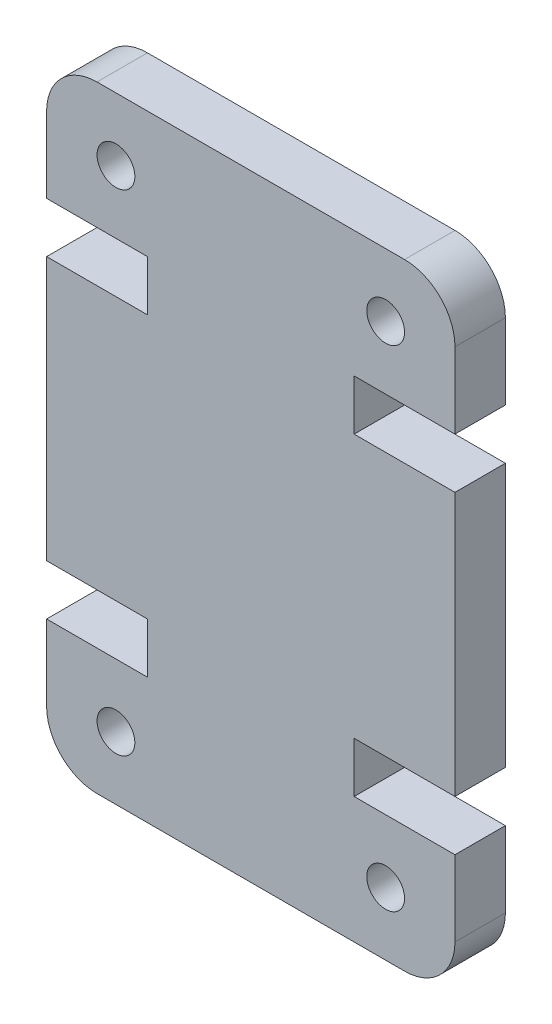
ISO-10303-21;
HEADER;
FILE_DESCRIPTION(('STEP AP214'),'2;1');
FILE_NAME('part.step','',(''),(''),'','','');
FILE_SCHEMA(('AUTOMOTIVE_DESIGN { 1 0 10303 214 1 1 1 1 }'));
ENDSEC;
DATA;
#1=APPLICATION_CONTEXT('core data for automotive mechanical design processes');
#2=APPLICATION_PROTOCOL_DEFINITION('international standard','automotive_design',2000,#1);
#3=PRODUCT_CONTEXT('',#1,'mechanical');
#4=PRODUCT('Part','Part','',(#3));
#5=PRODUCT_RELATED_PRODUCT_CATEGORY('part','',(#4));
#6=PRODUCT_DEFINITION_FORMATION('','',#4);
#7=PRODUCT_DEFINITION_CONTEXT('part definition',#1,'design');
#8=PRODUCT_DEFINITION('design','',#6,#7);
#9=PRODUCT_DEFINITION_SHAPE('','',#8);
#10=(LENGTH_UNIT() NAMED_UNIT(*) SI_UNIT(.MILLI.,.METRE.));
#11=(NAMED_UNIT(*) PLANE_ANGLE_UNIT() SI_UNIT($,.RADIAN.));
#12=(NAMED_UNIT(*) SI_UNIT($,.STERADIAN.) SOLID_ANGLE_UNIT());
#13=UNCERTAINTY_MEASURE_WITH_UNIT(LENGTH_MEASURE(1.E-05),#10,'distance_accuracy_value','');
#14=(GEOMETRIC_REPRESENTATION_CONTEXT(3) GLOBAL_UNCERTAINTY_ASSIGNED_CONTEXT((#13)) GLOBAL_UNIT_ASSIGNED_CONTEXT((#10,
#11,#12)) REPRESENTATION_CONTEXT('',''));
#15=CARTESIAN_POINT('',(0.,0.,0.));
#16=DIRECTION('',(0.,0.,1.));
#17=DIRECTION('',(1.,0.,0.));
#18=AXIS2_PLACEMENT_3D('',#15,#16,#17);
#19=CARTESIAN_POINT('',(2.,22.4500000000002,2.));
#20=DIRECTION('',(0.,0.,1.));
#21=DIRECTION('',(1.,0.,0.));
#22=AXIS2_PLACEMENT_3D('',#19,#20,#21);
#23=PLANE('',#22);
#24=CARTESIAN_POINT('',(13.4499999999968,21.9499999999998,2.));
#25=DIRECTION('',(0.,0.,1.));
#26=DIRECTION('',(1.,0.,0.));
#27=AXIS2_PLACEMENT_3D('',#24,#25,#26);
#28=CIRCLE('',#27,0.750000000000028);
#29=CARTESIAN_POINT('',(14.1999999999968,21.9499999999998,2.));
#30=VERTEX_POINT('',#29);
#31=EDGE_CURVE('E447',#30,#30,#28,.T.);
#32=ORIENTED_EDGE('',*,*,#31,.F.);
#33=EDGE_LOOP('',(#32));
#34=FACE_BOUND('',#33,.T.);
#35=CARTESIAN_POINT('',(13.4499999999983,2.49999999999968,2.));
#36=DIRECTION('',(0.,0.,1.));
#37=DIRECTION('',(1.,0.,0.));
#38=AXIS2_PLACEMENT_3D('',#35,#36,#37);
#39=CIRCLE('',#38,0.750000000000028);
#40=CARTESIAN_POINT('',(14.1999999999984,2.49999999999968,2.));
#41=VERTEX_POINT('',#40);
#42=EDGE_CURVE('E229',#41,#41,#39,.T.);
#43=ORIENTED_EDGE('',*,*,#42,.F.);
#44=EDGE_LOOP('',(#43));
#45=FACE_BOUND('',#44,.T.);
#46=CARTESIAN_POINT('',(2.,22.4500000000002,2.));
#47=DIRECTION('',(0.,0.,1.));
#48=DIRECTION('',(1.,0.,0.));
#49=AXIS2_PLACEMENT_3D('',#46,#47,#48);
#50=CIRCLE('',#49,2.);
#51=CARTESIAN_POINT('',(2.,24.4500000000002,2.));
#52=VERTEX_POINT('',#51);
#53=CARTESIAN_POINT('',(0.,22.4499999999998,2.));
#54=VERTEX_POINT('',#53);
#55=EDGE_CURVE('E272',#52,#54,#50,.T.);
#56=ORIENTED_EDGE('',*,*,#55,.T.);
#57=DIRECTION('',(0.,-1.,0.));
#58=VECTOR('',#57,1.);
#59=CARTESIAN_POINT('',(0.,22.4499999999998,2.));
#60=LINE('',#59,#58);
#61=CARTESIAN_POINT('',(0.,19.4500000000001,2.));
#62=VERTEX_POINT('',#61);
#63=EDGE_CURVE('E140',#54,#62,#60,.T.);
#64=ORIENTED_EDGE('',*,*,#63,.T.);
#65=DIRECTION('',(1.,0.,0.));
#66=VECTOR('',#65,1.);
#67=CARTESIAN_POINT('',(0.,19.4500000000001,2.));
#68=LINE('',#67,#66);
#69=CARTESIAN_POINT('',(4.00000000000111,19.4500000000001,2.));
#70=VERTEX_POINT('',#69);
#71=EDGE_CURVE('E335',#62,#70,#68,.T.);
#72=ORIENTED_EDGE('',*,*,#71,.T.);
#73=DIRECTION('',(0.,-1.,0.));
#74=VECTOR('',#73,1.);
#75=CARTESIAN_POINT('',(4.00000000000111,19.4500000000001,2.));
#76=LINE('',#75,#74);
#77=CARTESIAN_POINT('',(4.00000000000111,17.4500000000001,2.));
#78=VERTEX_POINT('',#77);
#79=EDGE_CURVE('E354',#70,#78,#76,.T.);
#80=ORIENTED_EDGE('',*,*,#79,.T.);
#81=DIRECTION('',(-1.,0.,0.));
#82=VECTOR('',#81,1.);
#83=CARTESIAN_POINT('',(4.00000000000111,17.4500000000001,2.));
#84=LINE('',#83,#82);
#85=CARTESIAN_POINT('',(0.,17.4500000000001,2.));
#86=VERTEX_POINT('',#85);
#87=EDGE_CURVE('E351',#78,#86,#84,.T.);
#88=ORIENTED_EDGE('',*,*,#87,.T.);
#89=DIRECTION('',(0.,-1.,0.));
#90=VECTOR('',#89,1.);
#91=CARTESIAN_POINT('',(0.,17.4500000000001,2.));
#92=LINE('',#91,#90);
#93=CARTESIAN_POINT('',(0.,7.00000000000012,2.));
#94=VERTEX_POINT('',#93);
#95=EDGE_CURVE('E353',#86,#94,#92,.T.);
#96=ORIENTED_EDGE('',*,*,#95,.T.);
#97=DIRECTION('',(1.,0.,0.));
#98=VECTOR('',#97,1.);
#99=CARTESIAN_POINT('',(0.,7.00000000000012,2.));
#100=LINE('',#99,#98);
#101=CARTESIAN_POINT('',(4.00000000000045,7.00000000000012,2.));
#102=VERTEX_POINT('',#101);
#103=EDGE_CURVE('E356',#94,#102,#100,.T.);
#104=ORIENTED_EDGE('',*,*,#103,.T.);
#105=DIRECTION('',(0.,-1.,0.));
#106=VECTOR('',#105,1.);
#107=CARTESIAN_POINT('',(4.00000000000045,7.00000000000012,2.));
#108=LINE('',#107,#106);
#109=CARTESIAN_POINT('',(4.00000000000045,5.00000000000014,2.));
#110=VERTEX_POINT('',#109);
#111=EDGE_CURVE('E362',#102,#110,#108,.T.);
#112=ORIENTED_EDGE('',*,*,#111,.T.);
#113=DIRECTION('',(-1.,0.,0.));
#114=VECTOR('',#113,1.);
#115=CARTESIAN_POINT('',(4.00000000000045,5.00000000000014,2.));
#116=LINE('',#115,#114);
#117=CARTESIAN_POINT('',(0.,5.00000000000014,2.));
#118=VERTEX_POINT('',#117);
#119=EDGE_CURVE('E364',#110,#118,#116,.T.);
#120=ORIENTED_EDGE('',*,*,#119,.T.);
#121=DIRECTION('',(0.,-1.,0.));
#122=VECTOR('',#121,1.);
#123=CARTESIAN_POINT('',(0.,5.00000000000014,2.));
#124=LINE('',#123,#122);
#125=CARTESIAN_POINT('',(0.,2.00000000000002,2.));
#126=VERTEX_POINT('',#125);
#127=EDGE_CURVE('E366',#118,#126,#124,.T.);
#128=ORIENTED_EDGE('',*,*,#127,.T.);
#129=CARTESIAN_POINT('',(2.,2.,2.));
#130=DIRECTION('',(0.,0.,1.));
#131=DIRECTION('',(1.,0.,0.));
#132=AXIS2_PLACEMENT_3D('',#129,#130,#131);
#133=CIRCLE('',#132,2.);
#134=CARTESIAN_POINT('',(2.,0.,2.));
#135=VERTEX_POINT('',#134);
#136=EDGE_CURVE('E368',#126,#135,#133,.T.);
#137=ORIENTED_EDGE('',*,*,#136,.T.);
#138=DIRECTION('',(1.,0.,0.));
#139=VECTOR('',#138,1.);
#140=CARTESIAN_POINT('',(2.,0.,2.));
#141=LINE('',#140,#139);
#142=CARTESIAN_POINT('',(14.1999999999865,0.,2.));
#143=VERTEX_POINT('',#142);
#144=EDGE_CURVE('E370',#135,#143,#141,.T.);
#145=ORIENTED_EDGE('',*,*,#144,.T.);
#146=CARTESIAN_POINT('',(14.1999999999856,1.99999999999989,2.));
#147=DIRECTION('',(0.,0.,1.));
#148=DIRECTION('',(1.,0.,0.));
#149=AXIS2_PLACEMENT_3D('',#146,#147,#148);
#150=CIRCLE('',#149,1.99999999999989);
#151=CARTESIAN_POINT('',(16.1999999999855,1.99999999999992,2.));
#152=VERTEX_POINT('',#151);
#153=EDGE_CURVE('E372',#143,#152,#150,.T.);
#154=ORIENTED_EDGE('',*,*,#153,.T.);
#155=DIRECTION('',(0.,1.,0.));
#156=VECTOR('',#155,1.);
#157=CARTESIAN_POINT('',(16.1999999999855,5.00000000000003,2.));
#158=LINE('',#157,#156);
#159=CARTESIAN_POINT('',(16.1999999999855,5.00000000000003,2.));
#160=VERTEX_POINT('',#159);
#161=EDGE_CURVE('E374',#152,#160,#158,.T.);
#162=ORIENTED_EDGE('',*,*,#161,.T.);
#163=DIRECTION('',(-1.,0.,0.));
#164=VECTOR('',#163,1.);
#165=CARTESIAN_POINT('',(12.1999999999864,5.00000000000003,2.));
#166=LINE('',#165,#164);
#167=CARTESIAN_POINT('',(12.1999999999864,5.00000000000003,2.));
#168=VERTEX_POINT('',#167);
#169=EDGE_CURVE('E376',#160,#168,#166,.T.);
#170=ORIENTED_EDGE('',*,*,#169,.T.);
#171=DIRECTION('',(0.,1.,0.));
#172=VECTOR('',#171,1.);
#173=CARTESIAN_POINT('',(12.1999999999864,7.00000000000002,2.));
#174=LINE('',#173,#172);
#175=CARTESIAN_POINT('',(12.1999999999864,7.00000000000002,2.));
#176=VERTEX_POINT('',#175);
#177=EDGE_CURVE('E378',#168,#176,#174,.T.);
#178=ORIENTED_EDGE('',*,*,#177,.T.);
#179=DIRECTION('',(1.,0.,0.));
#180=VECTOR('',#179,1.);
#181=CARTESIAN_POINT('',(16.1999999999991,7.00000000000002,2.));
#182=LINE('',#181,#180);
#183=CARTESIAN_POINT('',(16.1999999999991,7.00000000000002,2.));
#184=VERTEX_POINT('',#183);
#185=EDGE_CURVE('E380',#176,#184,#182,.T.);
#186=ORIENTED_EDGE('',*,*,#185,.T.);
#187=DIRECTION('',(0.,1.,0.));
#188=VECTOR('',#187,1.);
#189=CARTESIAN_POINT('',(16.1999999999991,17.4499999999885,2.));
#190=LINE('',#189,#188);
#191=CARTESIAN_POINT('',(16.1999999999991,17.4499999999885,2.));
#192=VERTEX_POINT('',#191);
#193=EDGE_CURVE('E382',#184,#192,#190,.T.);
#194=ORIENTED_EDGE('',*,*,#193,.T.);
#195=DIRECTION('',(-1.,0.,0.));
#196=VECTOR('',#195,1.);
#197=CARTESIAN_POINT('',(12.2000000000207,17.4499999999885,2.));
#198=LINE('',#197,#196);
#199=CARTESIAN_POINT('',(12.2000000000207,17.4499999999885,2.));
#200=VERTEX_POINT('',#199);
#201=EDGE_CURVE('E384',#192,#200,#198,.T.);
#202=ORIENTED_EDGE('',*,*,#201,.T.);
#203=DIRECTION('',(0.,1.,0.));
#204=VECTOR('',#203,1.);
#205=CARTESIAN_POINT('',(12.2000000000207,19.4499999999884,2.));
#206=LINE('',#205,#204);
#207=CARTESIAN_POINT('',(12.2000000000207,19.4499999999884,2.));
#208=VERTEX_POINT('',#207);
#209=EDGE_CURVE('E386',#200,#208,#206,.T.);
#210=ORIENTED_EDGE('',*,*,#209,.T.);
#211=DIRECTION('',(1.,0.,0.));
#212=VECTOR('',#211,1.);
#213=CARTESIAN_POINT('',(16.1999999999991,19.4499999999884,2.));
#214=LINE('',#213,#212);
#215=CARTESIAN_POINT('',(16.1999999999991,19.4499999999884,2.));
#216=VERTEX_POINT('',#215);
#217=EDGE_CURVE('E207',#208,#216,#214,.T.);
#218=ORIENTED_EDGE('',*,*,#217,.T.);
#219=DIRECTION('',(0.,1.,0.));
#220=VECTOR('',#219,1.);
#221=CARTESIAN_POINT('',(16.1999999999991,22.4499999999999,2.));
#222=LINE('',#221,#220);
#223=CARTESIAN_POINT('',(16.1999999999991,22.4499999999999,2.));
#224=VERTEX_POINT('',#223);
#225=EDGE_CURVE('E201',#216,#224,#222,.T.);
#226=ORIENTED_EDGE('',*,*,#225,.T.);
#227=CARTESIAN_POINT('',(14.1999999999992,22.4500000000003,2.));
#228=DIRECTION('',(0.,0.,1.));
#229=DIRECTION('',(1.,0.,0.));
#230=AXIS2_PLACEMENT_3D('',#227,#228,#229);
#231=CIRCLE('',#230,1.99999999999991);
#232=CARTESIAN_POINT('',(14.1999999999992,24.4500000000002,2.));
#233=VERTEX_POINT('',#232);
#234=EDGE_CURVE('E205',#224,#233,#231,.T.);
#235=ORIENTED_EDGE('',*,*,#234,.T.);
#236=DIRECTION('',(-1.,0.,0.));
#237=VECTOR('',#236,1.);
#238=CARTESIAN_POINT('',(2.,24.4500000000002,2.));
#239=LINE('',#238,#237);
#240=EDGE_CURVE('E49',#233,#52,#239,.T.);
#241=ORIENTED_EDGE('',*,*,#240,.T.);
#242=EDGE_LOOP('',(#56,#64,#72,#80,#88,#96,#104,#112,#120,#128,#137,#145,#154,#162,#170,#178,
#186,#194,#202,#210,#218,#226,#235,#241));
#243=FACE_BOUND('',#242,.T.);
#244=CARTESIAN_POINT('',(2.74999999999805,2.4999999999999,2.));
#245=DIRECTION('',(0.,0.,1.));
#246=DIRECTION('',(1.,0.,0.));
#247=AXIS2_PLACEMENT_3D('',#244,#245,#246);
#248=CIRCLE('',#247,0.750000000000028);
#249=CARTESIAN_POINT('',(3.49999999999808,2.4999999999999,2.));
#250=VERTEX_POINT('',#249);
#251=EDGE_CURVE('E453',#250,#250,#248,.T.);
#252=ORIENTED_EDGE('',*,*,#251,.F.);
#253=EDGE_LOOP('',(#252));
#254=FACE_BOUND('',#253,.T.);
#255=CARTESIAN_POINT('',(2.74999999999672,21.95,2.));
#256=DIRECTION('',(0.,0.,1.));
#257=DIRECTION('',(1.,0.,0.));
#258=AXIS2_PLACEMENT_3D('',#255,#256,#257);
#259=CIRCLE('',#258,0.750000000000028);
#260=CARTESIAN_POINT('',(3.49999999999675,21.95,2.));
#261=VERTEX_POINT('',#260);
#262=EDGE_CURVE('E438',#261,#261,#259,.T.);
#263=ORIENTED_EDGE('',*,*,#262,.F.);
#264=EDGE_LOOP('',(#263));
#265=FACE_BOUND('',#264,.T.);
#266=ADVANCED_FACE('F32',(#34,#45,#243,#254,#265),#23,.T.);
#267=CARTESIAN_POINT('',(2.,22.4500000000002,0.));
#268=DIRECTION('',(0.,0.,1.));
#269=DIRECTION('',(1.,0.,0.));
#270=AXIS2_PLACEMENT_3D('',#267,#268,#269);
#271=PLANE('',#270);
#272=CARTESIAN_POINT('',(13.4499999999968,21.9499999999998,0.));
#273=DIRECTION('',(0.,0.,1.));
#274=DIRECTION('',(1.,0.,0.));
#275=AXIS2_PLACEMENT_3D('',#272,#273,#274);
#276=CIRCLE('',#275,0.750000000000028);
#277=CARTESIAN_POINT('',(14.1999999999968,21.9499999999998,0.));
#278=VERTEX_POINT('',#277);
#279=EDGE_CURVE('E444',#278,#278,#276,.T.);
#280=ORIENTED_EDGE('',*,*,#279,.T.);
#281=EDGE_LOOP('',(#280));
#282=FACE_BOUND('',#281,.T.);
#283=CARTESIAN_POINT('',(13.4499999999983,2.49999999999968,0.));
#284=DIRECTION('',(0.,0.,1.));
#285=DIRECTION('',(1.,0.,0.));
#286=AXIS2_PLACEMENT_3D('',#283,#284,#285);
#287=CIRCLE('',#286,0.750000000000028);
#288=CARTESIAN_POINT('',(14.1999999999984,2.49999999999968,0.));
#289=VERTEX_POINT('',#288);
#290=EDGE_CURVE('E456',#289,#289,#287,.T.);
#291=ORIENTED_EDGE('',*,*,#290,.T.);
#292=EDGE_LOOP('',(#291));
#293=FACE_BOUND('',#292,.T.);
#294=CARTESIAN_POINT('',(2.,22.4500000000002,0.));
#295=DIRECTION('',(0.,0.,1.));
#296=DIRECTION('',(1.,0.,0.));
#297=AXIS2_PLACEMENT_3D('',#294,#295,#296);
#298=CIRCLE('',#297,2.);
#299=CARTESIAN_POINT('',(2.,24.4500000000002,0.));
#300=VERTEX_POINT('',#299);
#301=CARTESIAN_POINT('',(0.,22.4499999999998,0.));
#302=VERTEX_POINT('',#301);
#303=EDGE_CURVE('E225',#300,#302,#298,.T.);
#304=ORIENTED_EDGE('',*,*,#303,.F.);
#305=DIRECTION('',(-1.,0.,0.));
#306=VECTOR('',#305,1.);
#307=CARTESIAN_POINT('',(2.,24.4500000000002,0.));
#308=LINE('',#307,#306);
#309=CARTESIAN_POINT('',(14.1999999999992,24.4500000000002,0.));
#310=VERTEX_POINT('',#309);
#311=EDGE_CURVE('E132',#310,#300,#308,.T.);
#312=ORIENTED_EDGE('',*,*,#311,.F.);
#313=CARTESIAN_POINT('',(14.1999999999992,22.4500000000003,0.));
#314=DIRECTION('',(0.,0.,1.));
#315=DIRECTION('',(1.,0.,0.));
#316=AXIS2_PLACEMENT_3D('',#313,#314,#315);
#317=CIRCLE('',#316,1.99999999999991);
#318=CARTESIAN_POINT('',(16.1999999999991,22.4499999999999,0.));
#319=VERTEX_POINT('',#318);
#320=EDGE_CURVE('E126',#319,#310,#317,.T.);
#321=ORIENTED_EDGE('',*,*,#320,.F.);
#322=DIRECTION('',(0.,1.,0.));
#323=VECTOR('',#322,1.);
#324=CARTESIAN_POINT('',(16.1999999999991,22.4499999999999,0.));
#325=LINE('',#324,#323);
#326=CARTESIAN_POINT('',(16.1999999999991,19.4499999999884,0.));
#327=VERTEX_POINT('',#326);
#328=EDGE_CURVE('E215',#327,#319,#325,.T.);
#329=ORIENTED_EDGE('',*,*,#328,.F.);
#330=DIRECTION('',(1.,0.,0.));
#331=VECTOR('',#330,1.);
#332=CARTESIAN_POINT('',(16.1999999999991,19.4499999999884,0.));
#333=LINE('',#332,#331);
#334=CARTESIAN_POINT('',(12.2000000000207,19.4499999999884,0.));
#335=VERTEX_POINT('',#334);
#336=EDGE_CURVE('E267',#335,#327,#333,.T.);
#337=ORIENTED_EDGE('',*,*,#336,.F.);
#338=DIRECTION('',(0.,1.,0.));
#339=VECTOR('',#338,1.);
#340=CARTESIAN_POINT('',(12.2000000000207,19.4499999999884,0.));
#341=LINE('',#340,#339);
#342=CARTESIAN_POINT('',(12.2000000000207,17.4499999999885,0.));
#343=VERTEX_POINT('',#342);
#344=EDGE_CURVE('E265',#343,#335,#341,.T.);
#345=ORIENTED_EDGE('',*,*,#344,.F.);
#346=DIRECTION('',(-1.,0.,0.));
#347=VECTOR('',#346,1.);
#348=CARTESIAN_POINT('',(12.2000000000207,17.4499999999885,0.));
#349=LINE('',#348,#347);
#350=CARTESIAN_POINT('',(16.1999999999991,17.4499999999885,0.));
#351=VERTEX_POINT('',#350);
#352=EDGE_CURVE('E263',#351,#343,#349,.T.);
#353=ORIENTED_EDGE('',*,*,#352,.F.);
#354=DIRECTION('',(0.,1.,0.));
#355=VECTOR('',#354,1.);
#356=CARTESIAN_POINT('',(16.1999999999991,17.4499999999885,0.));
#357=LINE('',#356,#355);
#358=CARTESIAN_POINT('',(16.1999999999991,7.00000000000002,0.));
#359=VERTEX_POINT('',#358);
#360=EDGE_CURVE('E261',#359,#351,#357,.T.);
#361=ORIENTED_EDGE('',*,*,#360,.F.);
#362=DIRECTION('',(1.,0.,0.));
#363=VECTOR('',#362,1.);
#364=CARTESIAN_POINT('',(16.1999999999991,7.00000000000002,0.));
#365=LINE('',#364,#363);
#366=CARTESIAN_POINT('',(12.1999999999864,7.00000000000002,0.));
#367=VERTEX_POINT('',#366);
#368=EDGE_CURVE('E259',#367,#359,#365,.T.);
#369=ORIENTED_EDGE('',*,*,#368,.F.);
#370=DIRECTION('',(0.,1.,0.));
#371=VECTOR('',#370,1.);
#372=CARTESIAN_POINT('',(12.1999999999864,7.00000000000002,0.));
#373=LINE('',#372,#371);
#374=CARTESIAN_POINT('',(12.1999999999864,5.00000000000003,0.));
#375=VERTEX_POINT('',#374);
#376=EDGE_CURVE('E257',#375,#367,#373,.T.);
#377=ORIENTED_EDGE('',*,*,#376,.F.);
#378=DIRECTION('',(-1.,0.,0.));
#379=VECTOR('',#378,1.);
#380=CARTESIAN_POINT('',(12.1999999999864,5.00000000000003,0.));
#381=LINE('',#380,#379);
#382=CARTESIAN_POINT('',(16.1999999999855,5.00000000000003,0.));
#383=VERTEX_POINT('',#382);
#384=EDGE_CURVE('E255',#383,#375,#381,.T.);
#385=ORIENTED_EDGE('',*,*,#384,.F.);
#386=DIRECTION('',(0.,1.,0.));
#387=VECTOR('',#386,1.);
#388=CARTESIAN_POINT('',(16.1999999999855,5.00000000000003,0.));
#389=LINE('',#388,#387);
#390=CARTESIAN_POINT('',(16.1999999999855,1.99999999999992,0.));
#391=VERTEX_POINT('',#390);
#392=EDGE_CURVE('E253',#391,#383,#389,.T.);
#393=ORIENTED_EDGE('',*,*,#392,.F.);
#394=CARTESIAN_POINT('',(14.1999999999856,1.99999999999989,0.));
#395=DIRECTION('',(0.,0.,1.));
#396=DIRECTION('',(1.,0.,0.));
#397=AXIS2_PLACEMENT_3D('',#394,#395,#396);
#398=CIRCLE('',#397,1.99999999999989);
#399=CARTESIAN_POINT('',(14.1999999999865,0.,0.));
#400=VERTEX_POINT('',#399);
#401=EDGE_CURVE('E251',#400,#391,#398,.T.);
#402=ORIENTED_EDGE('',*,*,#401,.F.);
#403=DIRECTION('',(1.,0.,0.));
#404=VECTOR('',#403,1.);
#405=CARTESIAN_POINT('',(2.,0.,0.));
#406=LINE('',#405,#404);
#407=CARTESIAN_POINT('',(2.,0.,0.));
#408=VERTEX_POINT('',#407);
#409=EDGE_CURVE('E249',#408,#400,#406,.T.);
#410=ORIENTED_EDGE('',*,*,#409,.F.);
#411=CARTESIAN_POINT('',(2.,2.,0.));
#412=DIRECTION('',(0.,0.,1.));
#413=DIRECTION('',(1.,0.,0.));
#414=AXIS2_PLACEMENT_3D('',#411,#412,#413);
#415=CIRCLE('',#414,2.);
#416=CARTESIAN_POINT('',(0.,2.00000000000002,0.));
#417=VERTEX_POINT('',#416);
#418=EDGE_CURVE('E247',#417,#408,#415,.T.);
#419=ORIENTED_EDGE('',*,*,#418,.F.);
#420=DIRECTION('',(0.,-1.,0.));
#421=VECTOR('',#420,1.);
#422=CARTESIAN_POINT('',(0.,5.00000000000014,0.));
#423=LINE('',#422,#421);
#424=CARTESIAN_POINT('',(0.,5.00000000000014,0.));
#425=VERTEX_POINT('',#424);
#426=EDGE_CURVE('E245',#425,#417,#423,.T.);
#427=ORIENTED_EDGE('',*,*,#426,.F.);
#428=DIRECTION('',(-1.,0.,0.));
#429=VECTOR('',#428,1.);
#430=CARTESIAN_POINT('',(4.00000000000045,5.00000000000014,0.));
#431=LINE('',#430,#429);
#432=CARTESIAN_POINT('',(4.00000000000045,5.00000000000014,0.));
#433=VERTEX_POINT('',#432);
#434=EDGE_CURVE('E243',#433,#425,#431,.T.);
#435=ORIENTED_EDGE('',*,*,#434,.F.);
#436=DIRECTION('',(0.,-1.,0.));
#437=VECTOR('',#436,1.);
#438=CARTESIAN_POINT('',(4.00000000000045,7.00000000000012,0.));
#439=LINE('',#438,#437);
#440=CARTESIAN_POINT('',(4.00000000000045,7.00000000000012,0.));
#441=VERTEX_POINT('',#440);
#442=EDGE_CURVE('E241',#441,#433,#439,.T.);
#443=ORIENTED_EDGE('',*,*,#442,.F.);
#444=DIRECTION('',(1.,0.,0.));
#445=VECTOR('',#444,1.);
#446=CARTESIAN_POINT('',(0.,7.00000000000012,0.));
#447=LINE('',#446,#445);
#448=CARTESIAN_POINT('',(0.,7.00000000000012,0.));
#449=VERTEX_POINT('',#448);
#450=EDGE_CURVE('E239',#449,#441,#447,.T.);
#451=ORIENTED_EDGE('',*,*,#450,.F.);
#452=DIRECTION('',(0.,-1.,0.));
#453=VECTOR('',#452,1.);
#454=CARTESIAN_POINT('',(0.,17.4500000000001,0.));
#455=LINE('',#454,#453);
#456=CARTESIAN_POINT('',(0.,17.4500000000001,0.));
#457=VERTEX_POINT('',#456);
#458=EDGE_CURVE('E237',#457,#449,#455,.T.);
#459=ORIENTED_EDGE('',*,*,#458,.F.);
#460=DIRECTION('',(-1.,0.,0.));
#461=VECTOR('',#460,1.);
#462=CARTESIAN_POINT('',(4.00000000000111,17.4500000000001,0.));
#463=LINE('',#462,#461);
#464=CARTESIAN_POINT('',(4.00000000000111,17.4500000000001,0.));
#465=VERTEX_POINT('',#464);
#466=EDGE_CURVE('E235',#465,#457,#463,.T.);
#467=ORIENTED_EDGE('',*,*,#466,.F.);
#468=DIRECTION('',(0.,-1.,0.));
#469=VECTOR('',#468,1.);
#470=CARTESIAN_POINT('',(4.00000000000111,19.4500000000001,0.));
#471=LINE('',#470,#469);
#472=CARTESIAN_POINT('',(4.00000000000111,19.4500000000001,0.));
#473=VERTEX_POINT('',#472);
#474=EDGE_CURVE('E233',#473,#465,#471,.T.);
#475=ORIENTED_EDGE('',*,*,#474,.F.);
#476=DIRECTION('',(1.,0.,0.));
#477=VECTOR('',#476,1.);
#478=CARTESIAN_POINT('',(0.,19.4500000000001,0.));
#479=LINE('',#478,#477);
#480=CARTESIAN_POINT('',(0.,19.4500000000001,0.));
#481=VERTEX_POINT('',#480);
#482=EDGE_CURVE('E231',#481,#473,#479,.T.);
#483=ORIENTED_EDGE('',*,*,#482,.F.);
#484=DIRECTION('',(0.,-1.,0.));
#485=VECTOR('',#484,1.);
#486=CARTESIAN_POINT('',(0.,22.4499999999998,0.));
#487=LINE('',#486,#485);
#488=EDGE_CURVE('E228',#302,#481,#487,.T.);
#489=ORIENTED_EDGE('',*,*,#488,.F.);
#490=EDGE_LOOP('',(#304,#312,#321,#329,#337,#345,#353,#361,#369,#377,#385,#393,#402,#410,#419,
#427,#435,#443,#451,#459,#467,#475,#483,#489));
#491=FACE_BOUND('',#490,.T.);
#492=CARTESIAN_POINT('',(2.74999999999805,2.4999999999999,0.));
#493=DIRECTION('',(0.,0.,1.));
#494=DIRECTION('',(1.,0.,0.));
#495=AXIS2_PLACEMENT_3D('',#492,#493,#494);
#496=CIRCLE('',#495,0.750000000000028);
#497=CARTESIAN_POINT('',(3.49999999999808,2.4999999999999,0.));
#498=VERTEX_POINT('',#497);
#499=EDGE_CURVE('E450',#498,#498,#496,.T.);
#500=ORIENTED_EDGE('',*,*,#499,.T.);
#501=EDGE_LOOP('',(#500));
#502=FACE_BOUND('',#501,.T.);
#503=CARTESIAN_POINT('',(2.74999999999672,21.95,0.));
#504=DIRECTION('',(0.,0.,1.));
#505=DIRECTION('',(1.,0.,0.));
#506=AXIS2_PLACEMENT_3D('',#503,#504,#505);
#507=CIRCLE('',#506,0.750000000000028);
#508=CARTESIAN_POINT('',(3.49999999999675,21.95,0.));
#509=VERTEX_POINT('',#508);
#510=EDGE_CURVE('E441',#509,#509,#507,.T.);
#511=ORIENTED_EDGE('',*,*,#510,.T.);
#512=EDGE_LOOP('',(#511));
#513=FACE_BOUND('',#512,.T.);
#514=ADVANCED_FACE('F339',(#282,#293,#491,#502,#513),#271,.F.);
#515=CARTESIAN_POINT('',(2.,22.4500000000002,2.));
#516=DIRECTION('',(0.,0.,-1.));
#517=DIRECTION('',(-1.,0.,0.));
#518=AXIS2_PLACEMENT_3D('',#515,#516,#517);
#519=CYLINDRICAL_SURFACE('',#518,2.);
#520=ORIENTED_EDGE('',*,*,#303,.T.);
#521=DIRECTION('',(0.,0.,-1.));
#522=VECTOR('',#521,1.);
#523=CARTESIAN_POINT('',(0.,22.4499999999998,2.));
#524=LINE('',#523,#522);
#525=EDGE_CURVE('E11',#54,#302,#524,.T.);
#526=ORIENTED_EDGE('',*,*,#525,.F.);
#527=ORIENTED_EDGE('',*,*,#55,.F.);
#528=DIRECTION('',(0.,0.,-1.));
#529=VECTOR('',#528,1.);
#530=CARTESIAN_POINT('',(2.,24.4500000000002,2.));
#531=LINE('',#530,#529);
#532=EDGE_CURVE('E221',#52,#300,#531,.T.);
#533=ORIENTED_EDGE('',*,*,#532,.T.);
#534=EDGE_LOOP('',(#520,#526,#527,#533));
#535=FACE_BOUND('',#534,.T.);
#536=ADVANCED_FACE('F34',(#535),#519,.T.);
#537=CARTESIAN_POINT('',(0.,22.4499999999998,2.));
#538=DIRECTION('',(1.,0.,0.));
#539=DIRECTION('',(0.,1.,0.));
#540=AXIS2_PLACEMENT_3D('',#537,#538,#539);
#541=PLANE('',#540);
#542=ORIENTED_EDGE('',*,*,#488,.T.);
#543=DIRECTION('',(0.,0.,-1.));
#544=VECTOR('',#543,1.);
#545=CARTESIAN_POINT('',(0.,19.4500000000001,2.));
#546=LINE('',#545,#544);
#547=EDGE_CURVE('E41',#62,#481,#546,.T.);
#548=ORIENTED_EDGE('',*,*,#547,.F.);
#549=ORIENTED_EDGE('',*,*,#63,.F.);
#550=ORIENTED_EDGE('',*,*,#525,.T.);
#551=EDGE_LOOP('',(#542,#548,#549,#550));
#552=FACE_BOUND('',#551,.T.);
#553=ADVANCED_FACE('F685',(#552),#541,.F.);
#554=CARTESIAN_POINT('',(0.,19.4500000000001,2.));
#555=DIRECTION('',(0.,1.,0.));
#556=DIRECTION('',(0.,0.,1.));
#557=AXIS2_PLACEMENT_3D('',#554,#555,#556);
#558=PLANE('',#557);
#559=ORIENTED_EDGE('',*,*,#482,.T.);
#560=DIRECTION('',(0.,0.,-1.));
#561=VECTOR('',#560,1.);
#562=CARTESIAN_POINT('',(4.00000000000111,19.4500000000001,2.));
#563=LINE('',#562,#561);
#564=EDGE_CURVE('E327',#70,#473,#563,.T.);
#565=ORIENTED_EDGE('',*,*,#564,.F.);
#566=ORIENTED_EDGE('',*,*,#71,.F.);
#567=ORIENTED_EDGE('',*,*,#547,.T.);
#568=EDGE_LOOP('',(#559,#565,#566,#567));
#569=FACE_BOUND('',#568,.T.);
#570=ADVANCED_FACE('F333',(#569),#558,.F.);
#571=CARTESIAN_POINT('',(4.00000000000111,19.4500000000001,2.));
#572=DIRECTION('',(1.,0.,0.));
#573=DIRECTION('',(0.,1.,0.));
#574=AXIS2_PLACEMENT_3D('',#571,#572,#573);
#575=PLANE('',#574);
#576=ORIENTED_EDGE('',*,*,#474,.T.);
#577=DIRECTION('',(0.,0.,-1.));
#578=VECTOR('',#577,1.);
#579=CARTESIAN_POINT('',(4.00000000000111,17.4500000000001,2.));
#580=LINE('',#579,#578);
#581=EDGE_CURVE('E324',#78,#465,#580,.T.);
#582=ORIENTED_EDGE('',*,*,#581,.F.);
#583=ORIENTED_EDGE('',*,*,#79,.F.);
#584=ORIENTED_EDGE('',*,*,#564,.T.);
#585=EDGE_LOOP('',(#576,#582,#583,#584));
#586=FACE_BOUND('',#585,.T.);
#587=ADVANCED_FACE('F345',(#586),#575,.F.);
#588=CARTESIAN_POINT('',(4.00000000000111,17.4500000000001,2.));
#589=DIRECTION('',(0.,-1.,0.));
#590=DIRECTION('',(0.,0.,-1.));
#591=AXIS2_PLACEMENT_3D('',#588,#589,#590);
#592=PLANE('',#591);
#593=ORIENTED_EDGE('',*,*,#466,.T.);
#594=DIRECTION('',(0.,0.,-1.));
#595=VECTOR('',#594,1.);
#596=CARTESIAN_POINT('',(0.,17.4500000000001,2.));
#597=LINE('',#596,#595);
#598=EDGE_CURVE('E321',#86,#457,#597,.T.);
#599=ORIENTED_EDGE('',*,*,#598,.F.);
#600=ORIENTED_EDGE('',*,*,#87,.F.);
#601=ORIENTED_EDGE('',*,*,#581,.T.);
#602=EDGE_LOOP('',(#593,#599,#600,#601));
#603=FACE_BOUND('',#602,.T.);
#604=ADVANCED_FACE('F349',(#603),#592,.F.);
#605=CARTESIAN_POINT('',(0.,17.4500000000001,2.));
#606=DIRECTION('',(1.,0.,0.));
#607=DIRECTION('',(0.,1.,0.));
#608=AXIS2_PLACEMENT_3D('',#605,#606,#607);
#609=PLANE('',#608);
#610=ORIENTED_EDGE('',*,*,#458,.T.);
#611=DIRECTION('',(0.,0.,-1.));
#612=VECTOR('',#611,1.);
#613=CARTESIAN_POINT('',(0.,7.00000000000012,2.));
#614=LINE('',#613,#612);
#615=EDGE_CURVE('E318',#94,#449,#614,.T.);
#616=ORIENTED_EDGE('',*,*,#615,.F.);
#617=ORIENTED_EDGE('',*,*,#95,.F.);
#618=ORIENTED_EDGE('',*,*,#598,.T.);
#619=EDGE_LOOP('',(#610,#616,#617,#618));
#620=FACE_BOUND('',#619,.T.);
#621=ADVANCED_FACE('F650',(#620),#609,.F.);
#622=CARTESIAN_POINT('',(0.,7.00000000000012,2.));
#623=DIRECTION('',(0.,1.,0.));
#624=DIRECTION('',(0.,0.,1.));
#625=AXIS2_PLACEMENT_3D('',#622,#623,#624);
#626=PLANE('',#625);
#627=ORIENTED_EDGE('',*,*,#450,.T.);
#628=DIRECTION('',(0.,0.,-1.));
#629=VECTOR('',#628,1.);
#630=CARTESIAN_POINT('',(4.00000000000045,7.00000000000012,2.));
#631=LINE('',#630,#629);
#632=EDGE_CURVE('E315',#102,#441,#631,.T.);
#633=ORIENTED_EDGE('',*,*,#632,.F.);
#634=ORIENTED_EDGE('',*,*,#103,.F.);
#635=ORIENTED_EDGE('',*,*,#615,.T.);
#636=EDGE_LOOP('',(#627,#633,#634,#635));
#637=FACE_BOUND('',#636,.T.);
#638=ADVANCED_FACE('F640',(#637),#626,.F.);
#639=CARTESIAN_POINT('',(4.00000000000045,7.00000000000012,2.));
#640=DIRECTION('',(1.,0.,0.));
#641=DIRECTION('',(0.,0.,-1.));
#642=AXIS2_PLACEMENT_3D('',#639,#640,#641);
#643=PLANE('',#642);
#644=ORIENTED_EDGE('',*,*,#442,.T.);
#645=DIRECTION('',(0.,0.,-1.));
#646=VECTOR('',#645,1.);
#647=CARTESIAN_POINT('',(4.00000000000045,5.00000000000014,2.));
#648=LINE('',#647,#646);
#649=EDGE_CURVE('E312',#110,#433,#648,.T.);
#650=ORIENTED_EDGE('',*,*,#649,.F.);
#651=ORIENTED_EDGE('',*,*,#111,.F.);
#652=ORIENTED_EDGE('',*,*,#632,.T.);
#653=EDGE_LOOP('',(#644,#650,#651,#652));
#654=FACE_BOUND('',#653,.T.);
#655=ADVANCED_FACE('F630',(#654),#643,.F.);
#656=CARTESIAN_POINT('',(4.00000000000045,5.00000000000014,2.));
#657=DIRECTION('',(0.,-1.,0.));
#658=DIRECTION('',(0.,0.,-1.));
#659=AXIS2_PLACEMENT_3D('',#656,#657,#658);
#660=PLANE('',#659);
#661=ORIENTED_EDGE('',*,*,#434,.T.);
#662=DIRECTION('',(0.,0.,-1.));
#663=VECTOR('',#662,1.);
#664=CARTESIAN_POINT('',(0.,5.00000000000014,2.));
#665=LINE('',#664,#663);
#666=EDGE_CURVE('E309',#118,#425,#665,.T.);
#667=ORIENTED_EDGE('',*,*,#666,.F.);
#668=ORIENTED_EDGE('',*,*,#119,.F.);
#669=ORIENTED_EDGE('',*,*,#649,.T.);
#670=EDGE_LOOP('',(#661,#667,#668,#669));
#671=FACE_BOUND('',#670,.T.);
#672=ADVANCED_FACE('F620',(#671),#660,.F.);
#673=CARTESIAN_POINT('',(0.,5.00000000000014,2.));
#674=DIRECTION('',(1.,0.,0.));
#675=DIRECTION('',(0.,0.,-1.));
#676=AXIS2_PLACEMENT_3D('',#673,#674,#675);
#677=PLANE('',#676);
#678=ORIENTED_EDGE('',*,*,#426,.T.);
#679=DIRECTION('',(0.,0.,-1.));
#680=VECTOR('',#679,1.);
#681=CARTESIAN_POINT('',(0.,2.00000000000002,2.));
#682=LINE('',#681,#680);
#683=EDGE_CURVE('E306',#126,#417,#682,.T.);
#684=ORIENTED_EDGE('',*,*,#683,.F.);
#685=ORIENTED_EDGE('',*,*,#127,.F.);
#686=ORIENTED_EDGE('',*,*,#666,.T.);
#687=EDGE_LOOP('',(#678,#684,#685,#686));
#688=FACE_BOUND('',#687,.T.);
#689=ADVANCED_FACE('F610',(#688),#677,.F.);
#690=CARTESIAN_POINT('',(2.,2.,2.));
#691=DIRECTION('',(0.,0.,-1.));
#692=DIRECTION('',(-1.,0.,0.));
#693=AXIS2_PLACEMENT_3D('',#690,#691,#692);
#694=CYLINDRICAL_SURFACE('',#693,2.);
#695=ORIENTED_EDGE('',*,*,#418,.T.);
#696=DIRECTION('',(0.,0.,-1.));
#697=VECTOR('',#696,1.);
#698=CARTESIAN_POINT('',(2.,0.,2.));
#699=LINE('',#698,#697);
#700=EDGE_CURVE('E303',#135,#408,#699,.T.);
#701=ORIENTED_EDGE('',*,*,#700,.F.);
#702=ORIENTED_EDGE('',*,*,#136,.F.);
#703=ORIENTED_EDGE('',*,*,#683,.T.);
#704=EDGE_LOOP('',(#695,#701,#702,#703));
#705=FACE_BOUND('',#704,.T.);
#706=ADVANCED_FACE('F600',(#705),#694,.T.);
#707=CARTESIAN_POINT('',(2.,0.,2.));
#708=DIRECTION('',(0.,1.,0.));
#709=DIRECTION('',(0.,0.,1.));
#710=AXIS2_PLACEMENT_3D('',#707,#708,#709);
#711=PLANE('',#710);
#712=ORIENTED_EDGE('',*,*,#409,.T.);
#713=DIRECTION('',(0.,0.,-1.));
#714=VECTOR('',#713,1.);
#715=CARTESIAN_POINT('',(14.1999999999865,0.,2.));
#716=LINE('',#715,#714);
#717=EDGE_CURVE('E300',#143,#400,#716,.T.);
#718=ORIENTED_EDGE('',*,*,#717,.F.);
#719=ORIENTED_EDGE('',*,*,#144,.F.);
#720=ORIENTED_EDGE('',*,*,#700,.T.);
#721=EDGE_LOOP('',(#712,#718,#719,#720));
#722=FACE_BOUND('',#721,.T.);
#723=ADVANCED_FACE('F590',(#722),#711,.F.);
#724=CARTESIAN_POINT('',(14.1999999999856,1.99999999999989,2.));
#725=DIRECTION('',(0.,0.,-1.));
#726=DIRECTION('',(-1.,0.,0.));
#727=AXIS2_PLACEMENT_3D('',#724,#725,#726);
#728=CYLINDRICAL_SURFACE('',#727,1.99999999999989);
#729=ORIENTED_EDGE('',*,*,#401,.T.);
#730=DIRECTION('',(0.,0.,-1.));
#731=VECTOR('',#730,1.);
#732=CARTESIAN_POINT('',(16.1999999999855,1.99999999999992,2.));
#733=LINE('',#732,#731);
#734=EDGE_CURVE('E297',#152,#391,#733,.T.);
#735=ORIENTED_EDGE('',*,*,#734,.F.);
#736=ORIENTED_EDGE('',*,*,#153,.F.);
#737=ORIENTED_EDGE('',*,*,#717,.T.);
#738=EDGE_LOOP('',(#729,#735,#736,#737));
#739=FACE_BOUND('',#738,.T.);
#740=ADVANCED_FACE('F580',(#739),#728,.T.);
#741=CARTESIAN_POINT('',(16.1999999999855,5.00000000000003,2.));
#742=DIRECTION('',(-1.,0.,0.));
#743=DIRECTION('',(0.,0.,1.));
#744=AXIS2_PLACEMENT_3D('',#741,#742,#743);
#745=PLANE('',#744);
#746=ORIENTED_EDGE('',*,*,#392,.T.);
#747=DIRECTION('',(0.,0.,-1.));
#748=VECTOR('',#747,1.);
#749=CARTESIAN_POINT('',(16.1999999999855,5.00000000000003,2.));
#750=LINE('',#749,#748);
#751=EDGE_CURVE('E294',#160,#383,#750,.T.);
#752=ORIENTED_EDGE('',*,*,#751,.F.);
#753=ORIENTED_EDGE('',*,*,#161,.F.);
#754=ORIENTED_EDGE('',*,*,#734,.T.);
#755=EDGE_LOOP('',(#746,#752,#753,#754));
#756=FACE_BOUND('',#755,.T.);
#757=ADVANCED_FACE('F570',(#756),#745,.F.);
#758=CARTESIAN_POINT('',(12.1999999999864,5.00000000000003,2.));
#759=DIRECTION('',(0.,-1.,0.));
#760=DIRECTION('',(0.,0.,-1.));
#761=AXIS2_PLACEMENT_3D('',#758,#759,#760);
#762=PLANE('',#761);
#763=ORIENTED_EDGE('',*,*,#384,.T.);
#764=DIRECTION('',(0.,0.,-1.));
#765=VECTOR('',#764,1.);
#766=CARTESIAN_POINT('',(12.1999999999864,5.00000000000003,2.));
#767=LINE('',#766,#765);
#768=EDGE_CURVE('E291',#168,#375,#767,.T.);
#769=ORIENTED_EDGE('',*,*,#768,.F.);
#770=ORIENTED_EDGE('',*,*,#169,.F.);
#771=ORIENTED_EDGE('',*,*,#751,.T.);
#772=EDGE_LOOP('',(#763,#769,#770,#771));
#773=FACE_BOUND('',#772,.T.);
#774=ADVANCED_FACE('F560',(#773),#762,.F.);
#775=CARTESIAN_POINT('',(12.1999999999864,7.00000000000002,2.));
#776=DIRECTION('',(-1.,0.,0.));
#777=DIRECTION('',(0.,0.,1.));
#778=AXIS2_PLACEMENT_3D('',#775,#776,#777);
#779=PLANE('',#778);
#780=ORIENTED_EDGE('',*,*,#376,.T.);
#781=DIRECTION('',(0.,0.,-1.));
#782=VECTOR('',#781,1.);
#783=CARTESIAN_POINT('',(12.1999999999864,7.00000000000002,2.));
#784=LINE('',#783,#782);
#785=EDGE_CURVE('E288',#176,#367,#784,.T.);
#786=ORIENTED_EDGE('',*,*,#785,.F.);
#787=ORIENTED_EDGE('',*,*,#177,.F.);
#788=ORIENTED_EDGE('',*,*,#768,.T.);
#789=EDGE_LOOP('',(#780,#786,#787,#788));
#790=FACE_BOUND('',#789,.T.);
#791=ADVANCED_FACE('F550',(#790),#779,.F.);
#792=CARTESIAN_POINT('',(16.1999999999991,7.00000000000002,2.));
#793=DIRECTION('',(0.,1.,0.));
#794=DIRECTION('',(-1.,0.,0.));
#795=AXIS2_PLACEMENT_3D('',#792,#793,#794);
#796=PLANE('',#795);
#797=ORIENTED_EDGE('',*,*,#368,.T.);
#798=DIRECTION('',(0.,0.,-1.));
#799=VECTOR('',#798,1.);
#800=CARTESIAN_POINT('',(16.1999999999991,7.00000000000002,2.));
#801=LINE('',#800,#799);
#802=EDGE_CURVE('E285',#184,#359,#801,.T.);
#803=ORIENTED_EDGE('',*,*,#802,.F.);
#804=ORIENTED_EDGE('',*,*,#185,.F.);
#805=ORIENTED_EDGE('',*,*,#785,.T.);
#806=EDGE_LOOP('',(#797,#803,#804,#805));
#807=FACE_BOUND('',#806,.T.);
#808=ADVANCED_FACE('F540',(#807),#796,.F.);
#809=CARTESIAN_POINT('',(16.1999999999991,17.4499999999885,2.));
#810=DIRECTION('',(-1.,0.,0.));
#811=DIRECTION('',(0.,0.,1.));
#812=AXIS2_PLACEMENT_3D('',#809,#810,#811);
#813=PLANE('',#812);
#814=ORIENTED_EDGE('',*,*,#360,.T.);
#815=DIRECTION('',(0.,0.,-1.));
#816=VECTOR('',#815,1.);
#817=CARTESIAN_POINT('',(16.1999999999991,17.4499999999885,2.));
#818=LINE('',#817,#816);
#819=EDGE_CURVE('E282',#192,#351,#818,.T.);
#820=ORIENTED_EDGE('',*,*,#819,.F.);
#821=ORIENTED_EDGE('',*,*,#193,.F.);
#822=ORIENTED_EDGE('',*,*,#802,.T.);
#823=EDGE_LOOP('',(#814,#820,#821,#822));
#824=FACE_BOUND('',#823,.T.);
#825=ADVANCED_FACE('F530',(#824),#813,.F.);
#826=CARTESIAN_POINT('',(12.2000000000207,17.4499999999885,2.));
#827=DIRECTION('',(0.,-1.,0.));
#828=DIRECTION('',(0.,0.,-1.));
#829=AXIS2_PLACEMENT_3D('',#826,#827,#828);
#830=PLANE('',#829);
#831=ORIENTED_EDGE('',*,*,#352,.T.);
#832=DIRECTION('',(0.,0.,-1.));
#833=VECTOR('',#832,1.);
#834=CARTESIAN_POINT('',(12.2000000000207,17.4499999999885,2.));
#835=LINE('',#834,#833);
#836=EDGE_CURVE('E279',#200,#343,#835,.T.);
#837=ORIENTED_EDGE('',*,*,#836,.F.);
#838=ORIENTED_EDGE('',*,*,#201,.F.);
#839=ORIENTED_EDGE('',*,*,#819,.T.);
#840=EDGE_LOOP('',(#831,#837,#838,#839));
#841=FACE_BOUND('',#840,.T.);
#842=ADVANCED_FACE('F521',(#841),#830,.F.);
#843=CARTESIAN_POINT('',(12.2000000000207,19.4499999999884,2.));
#844=DIRECTION('',(-1.,0.,0.));
#845=DIRECTION('',(0.,0.,1.));
#846=AXIS2_PLACEMENT_3D('',#843,#844,#845);
#847=PLANE('',#846);
#848=ORIENTED_EDGE('',*,*,#344,.T.);
#849=DIRECTION('',(0.,0.,-1.));
#850=VECTOR('',#849,1.);
#851=CARTESIAN_POINT('',(12.2000000000207,19.4499999999884,2.));
#852=LINE('',#851,#850);
#853=EDGE_CURVE('E276',#208,#335,#852,.T.);
#854=ORIENTED_EDGE('',*,*,#853,.F.);
#855=ORIENTED_EDGE('',*,*,#209,.F.);
#856=ORIENTED_EDGE('',*,*,#836,.T.);
#857=EDGE_LOOP('',(#848,#854,#855,#856));
#858=FACE_BOUND('',#857,.T.);
#859=ADVANCED_FACE('F392',(#858),#847,.F.);
#860=CARTESIAN_POINT('',(16.1999999999991,19.4499999999884,2.));
#861=DIRECTION('',(0.,1.,0.));
#862=DIRECTION('',(0.,0.,1.));
#863=AXIS2_PLACEMENT_3D('',#860,#861,#862);
#864=PLANE('',#863);
#865=ORIENTED_EDGE('',*,*,#336,.T.);
#866=DIRECTION('',(0.,0.,-1.));
#867=VECTOR('',#866,1.);
#868=CARTESIAN_POINT('',(16.1999999999991,19.4499999999884,2.));
#869=LINE('',#868,#867);
#870=EDGE_CURVE('E216',#216,#327,#869,.T.);
#871=ORIENTED_EDGE('',*,*,#870,.F.);
#872=ORIENTED_EDGE('',*,*,#217,.F.);
#873=ORIENTED_EDGE('',*,*,#853,.T.);
#874=EDGE_LOOP('',(#865,#871,#872,#873));
#875=FACE_BOUND('',#874,.T.);
#876=ADVANCED_FACE('F396',(#875),#864,.F.);
#877=CARTESIAN_POINT('',(16.1999999999991,22.4499999999999,2.));
#878=DIRECTION('',(-1.,0.,0.));
#879=DIRECTION('',(0.,0.,1.));
#880=AXIS2_PLACEMENT_3D('',#877,#878,#879);
#881=PLANE('',#880);
#882=ORIENTED_EDGE('',*,*,#328,.T.);
#883=DIRECTION('',(0.,0.,-1.));
#884=VECTOR('',#883,1.);
#885=CARTESIAN_POINT('',(16.1999999999991,22.4499999999999,2.));
#886=LINE('',#885,#884);
#887=EDGE_CURVE('E212',#224,#319,#886,.T.);
#888=ORIENTED_EDGE('',*,*,#887,.F.);
#889=ORIENTED_EDGE('',*,*,#225,.F.);
#890=ORIENTED_EDGE('',*,*,#870,.T.);
#891=EDGE_LOOP('',(#882,#888,#889,#890));
#892=FACE_BOUND('',#891,.T.);
#893=ADVANCED_FACE('F213',(#892),#881,.F.);
#894=CARTESIAN_POINT('',(14.1999999999992,22.4500000000003,2.));
#895=DIRECTION('',(0.,0.,-1.));
#896=DIRECTION('',(-1.,0.,0.));
#897=AXIS2_PLACEMENT_3D('',#894,#895,#896);
#898=CYLINDRICAL_SURFACE('',#897,1.99999999999991);
#899=ORIENTED_EDGE('',*,*,#320,.T.);
#900=DIRECTION('',(0.,0.,-1.));
#901=VECTOR('',#900,1.);
#902=CARTESIAN_POINT('',(14.1999999999992,24.4500000000002,2.));
#903=LINE('',#902,#901);
#904=EDGE_CURVE('E217',#233,#310,#903,.T.);
#905=ORIENTED_EDGE('',*,*,#904,.F.);
#906=ORIENTED_EDGE('',*,*,#234,.F.);
#907=ORIENTED_EDGE('',*,*,#887,.T.);
#908=EDGE_LOOP('',(#899,#905,#906,#907));
#909=FACE_BOUND('',#908,.T.);
#910=ADVANCED_FACE('F219',(#909),#898,.T.);
#911=CARTESIAN_POINT('',(2.,24.4500000000002,2.));
#912=DIRECTION('',(0.,-1.,0.));
#913=DIRECTION('',(0.,0.,-1.));
#914=AXIS2_PLACEMENT_3D('',#911,#912,#913);
#915=PLANE('',#914);
#916=ORIENTED_EDGE('',*,*,#311,.T.);
#917=ORIENTED_EDGE('',*,*,#532,.F.);
#918=ORIENTED_EDGE('',*,*,#240,.F.);
#919=ORIENTED_EDGE('',*,*,#904,.T.);
#920=EDGE_LOOP('',(#916,#917,#918,#919));
#921=FACE_BOUND('',#920,.T.);
#922=ADVANCED_FACE('F400',(#921),#915,.F.);
#923=CARTESIAN_POINT('',(13.4499999999983,2.49999999999968,2.));
#924=DIRECTION('',(0.,0.,-1.));
#925=DIRECTION('',(-1.,0.,0.));
#926=AXIS2_PLACEMENT_3D('',#923,#924,#925);
#927=CYLINDRICAL_SURFACE('',#926,0.750000000000028);
#928=ORIENTED_EDGE('',*,*,#42,.T.);
#929=EDGE_LOOP('',(#928));
#930=FACE_BOUND('',#929,.T.);
#931=ORIENTED_EDGE('',*,*,#290,.F.);
#932=EDGE_LOOP('',(#931));
#933=FACE_BOUND('',#932,.T.);
#934=ADVANCED_FACE('F402',(#930,#933),#927,.F.);
#935=CARTESIAN_POINT('',(2.74999999999805,2.4999999999999,2.));
#936=DIRECTION('',(0.,0.,-1.));
#937=DIRECTION('',(-1.,0.,0.));
#938=AXIS2_PLACEMENT_3D('',#935,#936,#937);
#939=CYLINDRICAL_SURFACE('',#938,0.750000000000028);
#940=ORIENTED_EDGE('',*,*,#251,.T.);
#941=EDGE_LOOP('',(#940));
#942=FACE_BOUND('',#941,.T.);
#943=ORIENTED_EDGE('',*,*,#499,.F.);
#944=EDGE_LOOP('',(#943));
#945=FACE_BOUND('',#944,.T.);
#946=ADVANCED_FACE('F408',(#942,#945),#939,.F.);
#947=CARTESIAN_POINT('',(13.4499999999968,21.9499999999998,2.));
#948=DIRECTION('',(0.,0.,-1.));
#949=DIRECTION('',(-1.,0.,0.));
#950=AXIS2_PLACEMENT_3D('',#947,#948,#949);
#951=CYLINDRICAL_SURFACE('',#950,0.750000000000028);
#952=ORIENTED_EDGE('',*,*,#31,.T.);
#953=EDGE_LOOP('',(#952));
#954=FACE_BOUND('',#953,.T.);
#955=ORIENTED_EDGE('',*,*,#279,.F.);
#956=EDGE_LOOP('',(#955));
#957=FACE_BOUND('',#956,.T.);
#958=ADVANCED_FACE('F425',(#954,#957),#951,.F.);
#959=CARTESIAN_POINT('',(2.74999999999672,21.95,2.));
#960=DIRECTION('',(0.,0.,-1.));
#961=DIRECTION('',(-1.,0.,0.));
#962=AXIS2_PLACEMENT_3D('',#959,#960,#961);
#963=CYLINDRICAL_SURFACE('',#962,0.750000000000028);
#964=ORIENTED_EDGE('',*,*,#262,.T.);
#965=EDGE_LOOP('',(#964));
#966=FACE_BOUND('',#965,.T.);
#967=ORIENTED_EDGE('',*,*,#510,.F.);
#968=EDGE_LOOP('',(#967));
#969=FACE_BOUND('',#968,.T.);
#970=ADVANCED_FACE('F429',(#966,#969),#963,.F.);
#971=CLOSED_SHELL('',(#266,#514,#536,#553,#570,#587,#604,#621,#638,#655,#672,#689,#706,#723,
#740,#757,#774,#791,#808,#825,#842,#859,#876,#893,#910,#922,#934,#946,#958,#970));
#972=MANIFOLD_SOLID_BREP('B2',#971);
#973=ADVANCED_BREP_SHAPE_REPRESENTATION('',(#18,#972),#14);
#974=SHAPE_DEFINITION_REPRESENTATION(#9,#973);
ENDSEC;
END-ISO-10303-21;
